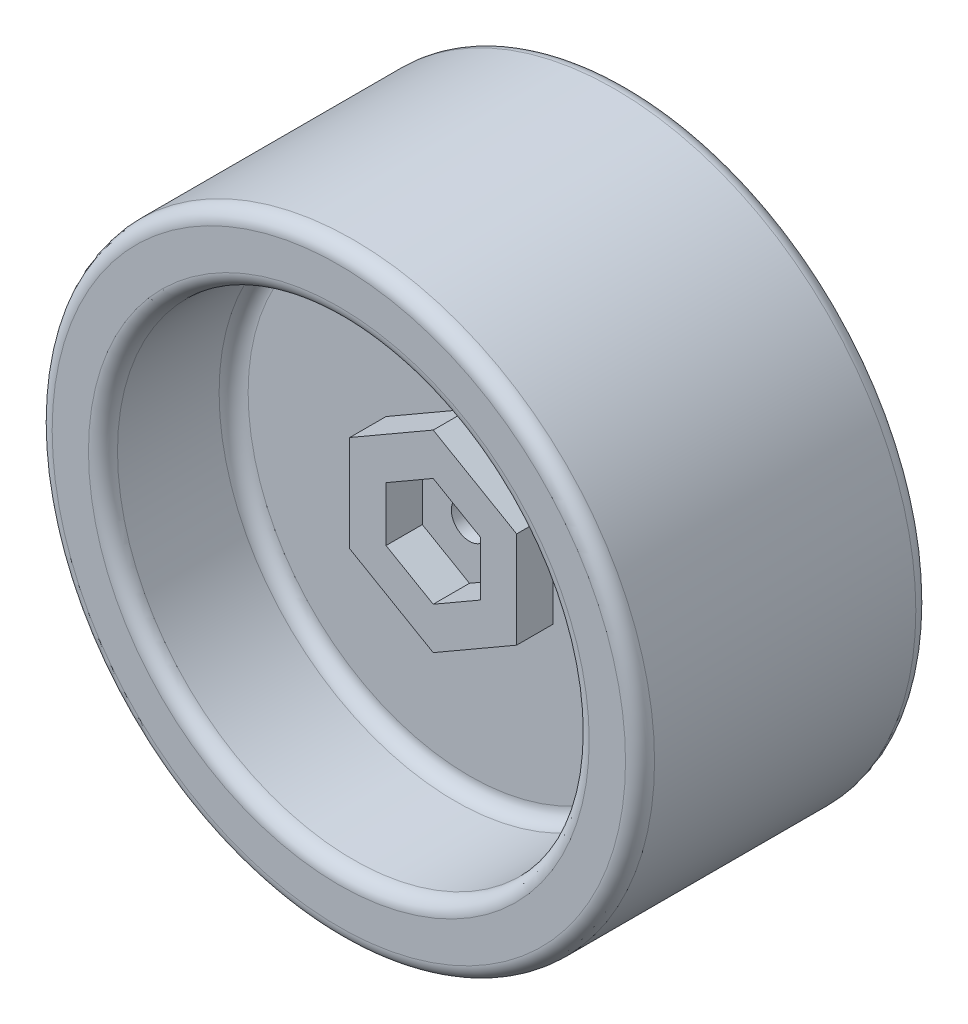
ISO-10303-21;
HEADER;
FILE_DESCRIPTION(('STEP AP214'),'2;1');
FILE_NAME('part.step','',(''),(''),'','','');
FILE_SCHEMA(('AUTOMOTIVE_DESIGN { 1 0 10303 214 1 1 1 1 }'));
ENDSEC;
DATA;
#1=APPLICATION_CONTEXT('core data for automotive mechanical design processes');
#2=APPLICATION_PROTOCOL_DEFINITION('international standard','automotive_design',2000,#1);
#3=PRODUCT_CONTEXT('',#1,'mechanical');
#4=PRODUCT('Part','Part','',(#3));
#5=PRODUCT_RELATED_PRODUCT_CATEGORY('part','',(#4));
#6=PRODUCT_DEFINITION_FORMATION('','',#4);
#7=PRODUCT_DEFINITION_CONTEXT('part definition',#1,'design');
#8=PRODUCT_DEFINITION('design','',#6,#7);
#9=PRODUCT_DEFINITION_SHAPE('','',#8);
#10=(LENGTH_UNIT() NAMED_UNIT(*) SI_UNIT(.MILLI.,.METRE.));
#11=(NAMED_UNIT(*) PLANE_ANGLE_UNIT() SI_UNIT($,.RADIAN.));
#12=(NAMED_UNIT(*) SI_UNIT($,.STERADIAN.) SOLID_ANGLE_UNIT());
#13=UNCERTAINTY_MEASURE_WITH_UNIT(LENGTH_MEASURE(1.E-05),#10,'distance_accuracy_value','');
#14=(GEOMETRIC_REPRESENTATION_CONTEXT(3) GLOBAL_UNCERTAINTY_ASSIGNED_CONTEXT((#13)) GLOBAL_UNIT_ASSIGNED_CONTEXT((#10,
#11,#12)) REPRESENTATION_CONTEXT('',''));
#15=CARTESIAN_POINT('',(0.,0.,0.));
#16=DIRECTION('',(0.,0.,1.));
#17=DIRECTION('',(1.,0.,0.));
#18=AXIS2_PLACEMENT_3D('',#15,#16,#17);
#19=CARTESIAN_POINT('',(0.,0.,0.));
#20=DIRECTION('',(0.,0.,1.));
#21=DIRECTION('',(1.,0.,0.));
#22=AXIS2_PLACEMENT_3D('',#19,#20,#21);
#23=CYLINDRICAL_SURFACE('',#22,2.5);
#24=CARTESIAN_POINT('',(0.,0.,18.));
#25=DIRECTION('',(0.,0.,-1.));
#26=DIRECTION('',(-1.,0.,0.));
#27=AXIS2_PLACEMENT_3D('',#24,#25,#26);
#28=CIRCLE('',#27,2.5);
#29=CARTESIAN_POINT('',(-2.5,0.,18.));
#30=VERTEX_POINT('',#29);
#31=EDGE_CURVE('E265',#30,#30,#28,.F.);
#32=ORIENTED_EDGE('',*,*,#31,.F.);
#33=EDGE_LOOP('',(#32));
#34=FACE_BOUND('',#33,.T.);
#35=CARTESIAN_POINT('',(0.,0.,22.));
#36=DIRECTION('',(0.,0.,1.));
#37=DIRECTION('',(1.,0.,0.));
#38=AXIS2_PLACEMENT_3D('',#35,#36,#37);
#39=CIRCLE('',#38,2.5);
#40=CARTESIAN_POINT('',(2.5,0.,22.));
#41=VERTEX_POINT('',#40);
#42=EDGE_CURVE('E177',#41,#41,#39,.F.);
#43=ORIENTED_EDGE('',*,*,#42,.F.);
#44=EDGE_LOOP('',(#43));
#45=FACE_BOUND('',#44,.T.);
#46=ADVANCED_FACE('F41',(#34,#45),#23,.F.);
#47=CARTESIAN_POINT('',(0.,0.,22.));
#48=DIRECTION('',(0.,0.,1.));
#49=DIRECTION('',(1.,0.,0.));
#50=AXIS2_PLACEMENT_3D('',#47,#48,#49);
#51=PLANE('',#50);
#52=CARTESIAN_POINT('',(0.,0.,22.));
#53=DIRECTION('',(0.,0.,1.));
#54=DIRECTION('',(1.,0.,0.));
#55=AXIS2_PLACEMENT_3D('',#52,#53,#54);
#56=CIRCLE('',#55,30.5);
#57=CARTESIAN_POINT('',(30.5,0.,22.));
#58=VERTEX_POINT('',#57);
#59=EDGE_CURVE('E281',#58,#58,#56,.T.);
#60=ORIENTED_EDGE('',*,*,#59,.T.);
#61=EDGE_LOOP('',(#60));
#62=FACE_BOUND('',#61,.T.);
#63=DIRECTION('',(-0.866025403784439,0.5,0.));
#64=VECTOR('',#63,1.);
#65=CARTESIAN_POINT('',(11.5,6.6395280956807,22.));
#66=LINE('',#65,#64);
#67=CARTESIAN_POINT('',(11.5,6.6395280956807,22.));
#68=VERTEX_POINT('',#67);
#69=CARTESIAN_POINT('',(0.,13.2790561913614,22.));
#70=VERTEX_POINT('',#69);
#71=EDGE_CURVE('E231',#68,#70,#66,.T.);
#72=ORIENTED_EDGE('',*,*,#71,.F.);
#73=DIRECTION('',(0.,1.,0.));
#74=VECTOR('',#73,1.);
#75=CARTESIAN_POINT('',(11.5,-6.6395280956807,22.));
#76=LINE('',#75,#74);
#77=CARTESIAN_POINT('',(11.5,-6.6395280956807,22.));
#78=VERTEX_POINT('',#77);
#79=EDGE_CURVE('E152',#78,#68,#76,.T.);
#80=ORIENTED_EDGE('',*,*,#79,.F.);
#81=DIRECTION('',(0.866025403784439,0.5,0.));
#82=VECTOR('',#81,1.);
#83=CARTESIAN_POINT('',(0.,-13.2790561913614,22.));
#84=LINE('',#83,#82);
#85=CARTESIAN_POINT('',(0.,-13.2790561913614,22.));
#86=VERTEX_POINT('',#85);
#87=EDGE_CURVE('E212',#86,#78,#84,.T.);
#88=ORIENTED_EDGE('',*,*,#87,.F.);
#89=DIRECTION('',(0.866025403784439,-0.5,0.));
#90=VECTOR('',#89,1.);
#91=CARTESIAN_POINT('',(-11.5,-6.6395280956807,22.));
#92=LINE('',#91,#90);
#93=CARTESIAN_POINT('',(-11.5,-6.6395280956807,22.));
#94=VERTEX_POINT('',#93);
#95=EDGE_CURVE('E240',#94,#86,#92,.T.);
#96=ORIENTED_EDGE('',*,*,#95,.F.);
#97=DIRECTION('',(0.,-1.,0.));
#98=VECTOR('',#97,1.);
#99=CARTESIAN_POINT('',(-11.5,6.6395280956807,22.));
#100=LINE('',#99,#98);
#101=CARTESIAN_POINT('',(-11.5,6.6395280956807,22.));
#102=VERTEX_POINT('',#101);
#103=EDGE_CURVE('E237',#102,#94,#100,.T.);
#104=ORIENTED_EDGE('',*,*,#103,.F.);
#105=DIRECTION('',(-0.866025403784439,-0.5,0.));
#106=VECTOR('',#105,1.);
#107=CARTESIAN_POINT('',(0.,13.2790561913614,22.));
#108=LINE('',#107,#106);
#109=EDGE_CURVE('E234',#70,#102,#108,.T.);
#110=ORIENTED_EDGE('',*,*,#109,.F.);
#111=EDGE_LOOP('',(#72,#80,#88,#96,#104,#110));
#112=FACE_BOUND('',#111,.T.);
#113=ADVANCED_FACE('F336',(#62,#112),#51,.T.);
#114=DIRECTION('',(0.,1.,0.));
#115=VECTOR('',#114,1.);
#116=CARTESIAN_POINT('',(6.5,-3.75277674973257,22.));
#117=LINE('',#116,#115);
#118=CARTESIAN_POINT('',(6.5,-3.75277674973257,22.));
#119=VERTEX_POINT('',#118);
#120=CARTESIAN_POINT('',(6.5,3.75277674973257,22.));
#121=VERTEX_POINT('',#120);
#122=EDGE_CURVE('E65',#119,#121,#117,.T.);
#123=ORIENTED_EDGE('',*,*,#122,.T.);
#124=DIRECTION('',(-0.866025403784439,0.5,0.));
#125=VECTOR('',#124,1.);
#126=CARTESIAN_POINT('',(6.5,3.75277674973257,22.));
#127=LINE('',#126,#125);
#128=CARTESIAN_POINT('',(0.,7.50555349946514,22.));
#129=VERTEX_POINT('',#128);
#130=EDGE_CURVE('E150',#121,#129,#127,.T.);
#131=ORIENTED_EDGE('',*,*,#130,.T.);
#132=DIRECTION('',(-0.866025403784439,-0.5,0.));
#133=VECTOR('',#132,1.);
#134=CARTESIAN_POINT('',(0.,7.50555349946514,22.));
#135=LINE('',#134,#133);
#136=CARTESIAN_POINT('',(-6.5,3.75277674973257,22.));
#137=VERTEX_POINT('',#136);
#138=EDGE_CURVE('E180',#129,#137,#135,.T.);
#139=ORIENTED_EDGE('',*,*,#138,.T.);
#140=DIRECTION('',(0.,-1.,0.));
#141=VECTOR('',#140,1.);
#142=CARTESIAN_POINT('',(-6.5,3.75277674973257,22.));
#143=LINE('',#142,#141);
#144=CARTESIAN_POINT('',(-6.5,-3.75277674973257,22.));
#145=VERTEX_POINT('',#144);
#146=EDGE_CURVE('E183',#137,#145,#143,.T.);
#147=ORIENTED_EDGE('',*,*,#146,.T.);
#148=DIRECTION('',(0.866025403784439,-0.5,0.));
#149=VECTOR('',#148,1.);
#150=CARTESIAN_POINT('',(-6.5,-3.75277674973257,22.));
#151=LINE('',#150,#149);
#152=CARTESIAN_POINT('',(0.,-7.50555349946514,22.));
#153=VERTEX_POINT('',#152);
#154=EDGE_CURVE('E186',#145,#153,#151,.T.);
#155=ORIENTED_EDGE('',*,*,#154,.T.);
#156=DIRECTION('',(0.866025403784439,0.5,0.));
#157=VECTOR('',#156,1.);
#158=CARTESIAN_POINT('',(0.,-7.50555349946514,22.));
#159=LINE('',#158,#157);
#160=EDGE_CURVE('E144',#153,#119,#159,.T.);
#161=ORIENTED_EDGE('',*,*,#160,.T.);
#162=EDGE_LOOP('',(#123,#131,#139,#147,#155,#161));
#163=FACE_BOUND('',#162,.T.);
#164=ORIENTED_EDGE('',*,*,#42,.T.);
#165=EDGE_LOOP('',(#164));
#166=FACE_BOUND('',#165,.T.);
#167=ADVANCED_FACE('F331',(#163,#166),#51,.T.);
#168=CARTESIAN_POINT('',(0.,0.,40.));
#169=DIRECTION('',(0.,0.,-1.));
#170=DIRECTION('',(-1.,0.,0.));
#171=AXIS2_PLACEMENT_3D('',#168,#169,#170);
#172=CYLINDRICAL_SURFACE('',#171,41.5);
#173=CARTESIAN_POINT('',(0.,0.,2.));
#174=DIRECTION('',(0.,0.,1.));
#175=DIRECTION('',(1.,0.,0.));
#176=AXIS2_PLACEMENT_3D('',#173,#174,#175);
#177=CIRCLE('',#176,41.5);
#178=CARTESIAN_POINT('',(41.5,0.,2.));
#179=VERTEX_POINT('',#178);
#180=EDGE_CURVE('E11',#179,#179,#177,.T.);
#181=ORIENTED_EDGE('',*,*,#180,.T.);
#182=EDGE_LOOP('',(#181));
#183=FACE_BOUND('',#182,.T.);
#184=CARTESIAN_POINT('',(0.,0.,38.));
#185=DIRECTION('',(0.,0.,1.));
#186=DIRECTION('',(1.,0.,0.));
#187=AXIS2_PLACEMENT_3D('',#184,#185,#186);
#188=CIRCLE('',#187,41.5);
#189=CARTESIAN_POINT('',(41.5,0.,38.));
#190=VERTEX_POINT('',#189);
#191=EDGE_CURVE('E50',#190,#190,#188,.F.);
#192=ORIENTED_EDGE('',*,*,#191,.T.);
#193=EDGE_LOOP('',(#192));
#194=FACE_BOUND('',#193,.T.);
#195=ADVANCED_FACE('F312',(#183,#194),#172,.T.);
#196=CARTESIAN_POINT('',(0.,0.,40.));
#197=DIRECTION('',(0.,0.,1.));
#198=DIRECTION('',(1.,0.,0.));
#199=AXIS2_PLACEMENT_3D('',#196,#197,#198);
#200=PLANE('',#199);
#201=CARTESIAN_POINT('',(0.,0.,40.));
#202=DIRECTION('',(0.,0.,1.));
#203=DIRECTION('',(1.,0.,0.));
#204=AXIS2_PLACEMENT_3D('',#201,#202,#203);
#205=CIRCLE('',#204,34.5);
#206=CARTESIAN_POINT('',(34.5,0.,40.));
#207=VERTEX_POINT('',#206);
#208=EDGE_CURVE('E297',#207,#207,#205,.F.);
#209=ORIENTED_EDGE('',*,*,#208,.T.);
#210=EDGE_LOOP('',(#209));
#211=FACE_BOUND('',#210,.T.);
#212=CARTESIAN_POINT('',(0.,0.,40.));
#213=DIRECTION('',(0.,0.,1.));
#214=DIRECTION('',(1.,0.,0.));
#215=AXIS2_PLACEMENT_3D('',#212,#213,#214);
#216=CIRCLE('',#215,39.5);
#217=CARTESIAN_POINT('',(39.5,0.,40.));
#218=VERTEX_POINT('',#217);
#219=EDGE_CURVE('E293',#218,#218,#216,.T.);
#220=ORIENTED_EDGE('',*,*,#219,.T.);
#221=EDGE_LOOP('',(#220));
#222=FACE_BOUND('',#221,.T.);
#223=ADVANCED_FACE('F319',(#211,#222),#200,.T.);
#224=CARTESIAN_POINT('',(0.,0.,0.));
#225=DIRECTION('',(0.,0.,1.));
#226=DIRECTION('',(1.,0.,0.));
#227=AXIS2_PLACEMENT_3D('',#224,#225,#226);
#228=PLANE('',#227);
#229=CARTESIAN_POINT('',(0.,0.,0.));
#230=DIRECTION('',(0.,0.,1.));
#231=DIRECTION('',(1.,0.,0.));
#232=AXIS2_PLACEMENT_3D('',#229,#230,#231);
#233=CIRCLE('',#232,34.5);
#234=CARTESIAN_POINT('',(34.5,0.,0.));
#235=VERTEX_POINT('',#234);
#236=EDGE_CURVE('E305',#235,#235,#233,.T.);
#237=ORIENTED_EDGE('',*,*,#236,.T.);
#238=EDGE_LOOP('',(#237));
#239=FACE_BOUND('',#238,.T.);
#240=CARTESIAN_POINT('',(0.,0.,0.));
#241=DIRECTION('',(0.,0.,1.));
#242=DIRECTION('',(1.,0.,0.));
#243=AXIS2_PLACEMENT_3D('',#240,#241,#242);
#244=CIRCLE('',#243,39.5);
#245=CARTESIAN_POINT('',(39.5,0.,0.));
#246=VERTEX_POINT('',#245);
#247=EDGE_CURVE('E301',#246,#246,#244,.F.);
#248=ORIENTED_EDGE('',*,*,#247,.T.);
#249=EDGE_LOOP('',(#248));
#250=FACE_BOUND('',#249,.T.);
#251=ADVANCED_FACE('F321',(#239,#250),#228,.F.);
#252=CARTESIAN_POINT('',(0.,0.,18.));
#253=DIRECTION('',(0.,0.,-1.));
#254=DIRECTION('',(-1.,0.,0.));
#255=AXIS2_PLACEMENT_3D('',#252,#253,#254);
#256=PLANE('',#255);
#257=CARTESIAN_POINT('',(0.,0.,18.));
#258=DIRECTION('',(0.,0.,-1.));
#259=DIRECTION('',(-1.,0.,0.));
#260=AXIS2_PLACEMENT_3D('',#257,#258,#259);
#261=CIRCLE('',#260,30.5);
#262=CARTESIAN_POINT('',(-30.5,0.,18.));
#263=VERTEX_POINT('',#262);
#264=EDGE_CURVE('E269',#263,#263,#261,.T.);
#265=ORIENTED_EDGE('',*,*,#264,.T.);
#266=EDGE_LOOP('',(#265));
#267=FACE_BOUND('',#266,.T.);
#268=ORIENTED_EDGE('',*,*,#31,.T.);
#269=EDGE_LOOP('',(#268));
#270=FACE_BOUND('',#269,.T.);
#271=ADVANCED_FACE('F328',(#267,#270),#256,.T.);
#272=CARTESIAN_POINT('',(0.,0.,18.));
#273=DIRECTION('',(0.,0.,-1.));
#274=DIRECTION('',(-1.,0.,0.));
#275=AXIS2_PLACEMENT_3D('',#272,#273,#274);
#276=CYLINDRICAL_SURFACE('',#275,32.5);
#277=CARTESIAN_POINT('',(0.,0.,16.));
#278=DIRECTION('',(0.,0.,-1.));
#279=DIRECTION('',(-1.,0.,0.));
#280=AXIS2_PLACEMENT_3D('',#277,#278,#279);
#281=CIRCLE('',#280,32.5);
#282=CARTESIAN_POINT('',(-32.5,0.,16.));
#283=VERTEX_POINT('',#282);
#284=EDGE_CURVE('E277',#283,#283,#281,.F.);
#285=ORIENTED_EDGE('',*,*,#284,.T.);
#286=EDGE_LOOP('',(#285));
#287=FACE_BOUND('',#286,.T.);
#288=CARTESIAN_POINT('',(0.,0.,2.));
#289=DIRECTION('',(0.,0.,1.));
#290=DIRECTION('',(1.,0.,0.));
#291=AXIS2_PLACEMENT_3D('',#288,#289,#290);
#292=CIRCLE('',#291,32.5);
#293=CARTESIAN_POINT('',(32.5,0.,2.));
#294=VERTEX_POINT('',#293);
#295=EDGE_CURVE('E273',#294,#294,#292,.F.);
#296=ORIENTED_EDGE('',*,*,#295,.T.);
#297=EDGE_LOOP('',(#296));
#298=FACE_BOUND('',#297,.T.);
#299=ADVANCED_FACE('F346',(#287,#298),#276,.F.);
#300=CARTESIAN_POINT('',(0.,0.,22.));
#301=DIRECTION('',(0.,0.,1.));
#302=DIRECTION('',(1.,0.,0.));
#303=AXIS2_PLACEMENT_3D('',#300,#301,#302);
#304=CYLINDRICAL_SURFACE('',#303,32.5);
#305=CARTESIAN_POINT('',(0.,0.,24.));
#306=DIRECTION('',(0.,0.,1.));
#307=DIRECTION('',(1.,0.,0.));
#308=AXIS2_PLACEMENT_3D('',#305,#306,#307);
#309=CIRCLE('',#308,32.5);
#310=CARTESIAN_POINT('',(32.5,0.,24.));
#311=VERTEX_POINT('',#310);
#312=EDGE_CURVE('E289',#311,#311,#309,.F.);
#313=ORIENTED_EDGE('',*,*,#312,.T.);
#314=EDGE_LOOP('',(#313));
#315=FACE_BOUND('',#314,.T.);
#316=CARTESIAN_POINT('',(0.,0.,38.));
#317=DIRECTION('',(0.,0.,1.));
#318=DIRECTION('',(1.,0.,0.));
#319=AXIS2_PLACEMENT_3D('',#316,#317,#318);
#320=CIRCLE('',#319,32.5);
#321=CARTESIAN_POINT('',(32.5,0.,38.));
#322=VERTEX_POINT('',#321);
#323=EDGE_CURVE('E285',#322,#322,#320,.T.);
#324=ORIENTED_EDGE('',*,*,#323,.T.);
#325=EDGE_LOOP('',(#324));
#326=FACE_BOUND('',#325,.T.);
#327=ADVANCED_FACE('F349',(#315,#326),#304,.F.);
#328=CARTESIAN_POINT('',(0.,0.,16.));
#329=DIRECTION('',(0.,0.,-1.));
#330=DIRECTION('',(-1.,0.,0.));
#331=AXIS2_PLACEMENT_3D('',#328,#329,#330);
#332=TOROIDAL_SURFACE('',#331,30.5,2.);
#333=ORIENTED_EDGE('',*,*,#284,.F.);
#334=EDGE_LOOP('',(#333));
#335=FACE_BOUND('',#334,.T.);
#336=ORIENTED_EDGE('',*,*,#264,.F.);
#337=EDGE_LOOP('',(#336));
#338=FACE_BOUND('',#337,.T.);
#339=ADVANCED_FACE('F355',(#335,#338),#332,.F.);
#340=CARTESIAN_POINT('',(0.,0.,24.));
#341=DIRECTION('',(0.,0.,1.));
#342=DIRECTION('',(1.,0.,0.));
#343=AXIS2_PLACEMENT_3D('',#340,#341,#342);
#344=TOROIDAL_SURFACE('',#343,30.5,2.);
#345=ORIENTED_EDGE('',*,*,#312,.F.);
#346=EDGE_LOOP('',(#345));
#347=FACE_BOUND('',#346,.T.);
#348=ORIENTED_EDGE('',*,*,#59,.F.);
#349=EDGE_LOOP('',(#348));
#350=FACE_BOUND('',#349,.T.);
#351=ADVANCED_FACE('F491',(#347,#350),#344,.F.);
#352=CARTESIAN_POINT('',(0.,0.,38.));
#353=DIRECTION('',(0.,0.,1.));
#354=DIRECTION('',(1.,0.,0.));
#355=AXIS2_PLACEMENT_3D('',#352,#353,#354);
#356=TOROIDAL_SURFACE('',#355,34.5,2.);
#357=ORIENTED_EDGE('',*,*,#208,.F.);
#358=EDGE_LOOP('',(#357));
#359=FACE_BOUND('',#358,.T.);
#360=ORIENTED_EDGE('',*,*,#323,.F.);
#361=EDGE_LOOP('',(#360));
#362=FACE_BOUND('',#361,.T.);
#363=ADVANCED_FACE('F483',(#359,#362),#356,.T.);
#364=CARTESIAN_POINT('',(0.,0.,2.));
#365=DIRECTION('',(0.,0.,1.));
#366=DIRECTION('',(1.,0.,0.));
#367=AXIS2_PLACEMENT_3D('',#364,#365,#366);
#368=TOROIDAL_SURFACE('',#367,34.5,2.);
#369=ORIENTED_EDGE('',*,*,#236,.F.);
#370=EDGE_LOOP('',(#369));
#371=FACE_BOUND('',#370,.T.);
#372=ORIENTED_EDGE('',*,*,#295,.F.);
#373=EDGE_LOOP('',(#372));
#374=FACE_BOUND('',#373,.T.);
#375=ADVANCED_FACE('F476',(#371,#374),#368,.T.);
#376=CARTESIAN_POINT('',(0.,0.,2.));
#377=DIRECTION('',(0.,0.,1.));
#378=DIRECTION('',(1.,0.,0.));
#379=AXIS2_PLACEMENT_3D('',#376,#377,#378);
#380=TOROIDAL_SURFACE('',#379,39.5,2.);
#381=ORIENTED_EDGE('',*,*,#247,.F.);
#382=EDGE_LOOP('',(#381));
#383=FACE_BOUND('',#382,.T.);
#384=ORIENTED_EDGE('',*,*,#180,.F.);
#385=EDGE_LOOP('',(#384));
#386=FACE_BOUND('',#385,.T.);
#387=ADVANCED_FACE('F316',(#383,#386),#380,.T.);
#388=CARTESIAN_POINT('',(0.,0.,38.));
#389=DIRECTION('',(0.,0.,1.));
#390=DIRECTION('',(1.,0.,0.));
#391=AXIS2_PLACEMENT_3D('',#388,#389,#390);
#392=TOROIDAL_SURFACE('',#391,39.5,2.);
#393=ORIENTED_EDGE('',*,*,#191,.F.);
#394=EDGE_LOOP('',(#393));
#395=FACE_BOUND('',#394,.T.);
#396=ORIENTED_EDGE('',*,*,#219,.F.);
#397=EDGE_LOOP('',(#396));
#398=FACE_BOUND('',#397,.T.);
#399=ADVANCED_FACE('F43',(#395,#398),#392,.T.);
#400=CARTESIAN_POINT('',(0.,0.,27.));
#401=DIRECTION('',(0.,0.,1.));
#402=DIRECTION('',(1.,0.,0.));
#403=AXIS2_PLACEMENT_3D('',#400,#401,#402);
#404=PLANE('',#403);
#405=DIRECTION('',(0.,1.,0.));
#406=VECTOR('',#405,1.);
#407=CARTESIAN_POINT('',(11.5,-6.6395280956807,27.));
#408=LINE('',#407,#406);
#409=CARTESIAN_POINT('',(11.5,-6.6395280956807,27.));
#410=VERTEX_POINT('',#409);
#411=CARTESIAN_POINT('',(11.5,6.6395280956807,27.));
#412=VERTEX_POINT('',#411);
#413=EDGE_CURVE('E207',#410,#412,#408,.T.);
#414=ORIENTED_EDGE('',*,*,#413,.T.);
#415=DIRECTION('',(-0.866025403784439,0.5,0.));
#416=VECTOR('',#415,1.);
#417=CARTESIAN_POINT('',(11.5,6.6395280956807,27.));
#418=LINE('',#417,#416);
#419=CARTESIAN_POINT('',(0.,13.2790561913614,27.));
#420=VERTEX_POINT('',#419);
#421=EDGE_CURVE('E211',#412,#420,#418,.T.);
#422=ORIENTED_EDGE('',*,*,#421,.T.);
#423=DIRECTION('',(-0.866025403784439,-0.5,0.));
#424=VECTOR('',#423,1.);
#425=CARTESIAN_POINT('',(0.,13.2790561913614,27.));
#426=LINE('',#425,#424);
#427=CARTESIAN_POINT('',(-11.5,6.6395280956807,27.));
#428=VERTEX_POINT('',#427);
#429=EDGE_CURVE('E215',#420,#428,#426,.T.);
#430=ORIENTED_EDGE('',*,*,#429,.T.);
#431=DIRECTION('',(0.,-1.,0.));
#432=VECTOR('',#431,1.);
#433=CARTESIAN_POINT('',(-11.5,6.6395280956807,27.));
#434=LINE('',#433,#432);
#435=CARTESIAN_POINT('',(-11.5,-6.6395280956807,27.));
#436=VERTEX_POINT('',#435);
#437=EDGE_CURVE('E218',#428,#436,#434,.T.);
#438=ORIENTED_EDGE('',*,*,#437,.T.);
#439=DIRECTION('',(0.866025403784439,-0.5,0.));
#440=VECTOR('',#439,1.);
#441=CARTESIAN_POINT('',(-11.5,-6.6395280956807,27.));
#442=LINE('',#441,#440);
#443=CARTESIAN_POINT('',(0.,-13.2790561913614,27.));
#444=VERTEX_POINT('',#443);
#445=EDGE_CURVE('E221',#436,#444,#442,.T.);
#446=ORIENTED_EDGE('',*,*,#445,.T.);
#447=DIRECTION('',(0.866025403784439,0.5,0.));
#448=VECTOR('',#447,1.);
#449=CARTESIAN_POINT('',(0.,-13.2790561913614,27.));
#450=LINE('',#449,#448);
#451=EDGE_CURVE('E224',#444,#410,#450,.T.);
#452=ORIENTED_EDGE('',*,*,#451,.T.);
#453=EDGE_LOOP('',(#414,#422,#430,#438,#446,#452));
#454=FACE_BOUND('',#453,.T.);
#455=DIRECTION('',(-0.866025403784439,0.5,0.));
#456=VECTOR('',#455,1.);
#457=CARTESIAN_POINT('',(6.5,3.75277674973257,27.));
#458=LINE('',#457,#456);
#459=CARTESIAN_POINT('',(6.5,3.75277674973257,27.));
#460=VERTEX_POINT('',#459);
#461=CARTESIAN_POINT('',(0.,7.50555349946514,27.));
#462=VERTEX_POINT('',#461);
#463=EDGE_CURVE('E143',#460,#462,#458,.T.);
#464=ORIENTED_EDGE('',*,*,#463,.F.);
#465=DIRECTION('',(0.,1.,0.));
#466=VECTOR('',#465,1.);
#467=CARTESIAN_POINT('',(6.5,-3.75277674973257,27.));
#468=LINE('',#467,#466);
#469=CARTESIAN_POINT('',(6.5,-3.75277674973257,27.));
#470=VERTEX_POINT('',#469);
#471=EDGE_CURVE('E133',#470,#460,#468,.T.);
#472=ORIENTED_EDGE('',*,*,#471,.F.);
#473=DIRECTION('',(0.866025403784439,0.5,0.));
#474=VECTOR('',#473,1.);
#475=CARTESIAN_POINT('',(0.,-7.50555349946514,27.));
#476=LINE('',#475,#474);
#477=CARTESIAN_POINT('',(0.,-7.50555349946514,27.));
#478=VERTEX_POINT('',#477);
#479=EDGE_CURVE('E172',#478,#470,#476,.T.);
#480=ORIENTED_EDGE('',*,*,#479,.F.);
#481=DIRECTION('',(0.866025403784439,-0.5,0.));
#482=VECTOR('',#481,1.);
#483=CARTESIAN_POINT('',(-6.5,-3.75277674973257,27.));
#484=LINE('',#483,#482);
#485=CARTESIAN_POINT('',(-6.5,-3.75277674973257,27.));
#486=VERTEX_POINT('',#485);
#487=EDGE_CURVE('E168',#486,#478,#484,.T.);
#488=ORIENTED_EDGE('',*,*,#487,.F.);
#489=DIRECTION('',(0.,-1.,0.));
#490=VECTOR('',#489,1.);
#491=CARTESIAN_POINT('',(-6.5,3.75277674973257,27.));
#492=LINE('',#491,#490);
#493=CARTESIAN_POINT('',(-6.5,3.75277674973257,27.));
#494=VERTEX_POINT('',#493);
#495=EDGE_CURVE('E162',#494,#486,#492,.T.);
#496=ORIENTED_EDGE('',*,*,#495,.F.);
#497=DIRECTION('',(-0.866025403784439,-0.5,0.));
#498=VECTOR('',#497,1.);
#499=CARTESIAN_POINT('',(0.,7.50555349946514,27.));
#500=LINE('',#499,#498);
#501=EDGE_CURVE('E158',#462,#494,#500,.T.);
#502=ORIENTED_EDGE('',*,*,#501,.F.);
#503=EDGE_LOOP('',(#464,#472,#480,#488,#496,#502));
#504=FACE_BOUND('',#503,.T.);
#505=ADVANCED_FACE('F156',(#454,#504),#404,.T.);
#506=CARTESIAN_POINT('',(11.5,-6.6395280956807,27.));
#507=DIRECTION('',(-1.,0.,0.));
#508=DIRECTION('',(0.,0.,1.));
#509=AXIS2_PLACEMENT_3D('',#506,#507,#508);
#510=PLANE('',#509);
#511=ORIENTED_EDGE('',*,*,#79,.T.);
#512=DIRECTION('',(0.,0.,-1.));
#513=VECTOR('',#512,1.);
#514=CARTESIAN_POINT('',(11.5,6.6395280956807,27.));
#515=LINE('',#514,#513);
#516=EDGE_CURVE('E262',#412,#68,#515,.T.);
#517=ORIENTED_EDGE('',*,*,#516,.F.);
#518=ORIENTED_EDGE('',*,*,#413,.F.);
#519=DIRECTION('',(0.,0.,-1.));
#520=VECTOR('',#519,1.);
#521=CARTESIAN_POINT('',(11.5,-6.6395280956807,27.));
#522=LINE('',#521,#520);
#523=EDGE_CURVE('E227',#410,#78,#522,.T.);
#524=ORIENTED_EDGE('',*,*,#523,.T.);
#525=EDGE_LOOP('',(#511,#517,#518,#524));
#526=FACE_BOUND('',#525,.T.);
#527=ADVANCED_FACE('F359',(#526),#510,.F.);
#528=CARTESIAN_POINT('',(11.5,6.6395280956807,27.));
#529=DIRECTION('',(-0.5,-0.866025403784439,0.));
#530=DIRECTION('',(0.866025403784439,-0.5,0.));
#531=AXIS2_PLACEMENT_3D('',#528,#529,#530);
#532=PLANE('',#531);
#533=ORIENTED_EDGE('',*,*,#71,.T.);
#534=DIRECTION('',(0.,0.,-1.));
#535=VECTOR('',#534,1.);
#536=CARTESIAN_POINT('',(0.,13.2790561913614,27.));
#537=LINE('',#536,#535);
#538=EDGE_CURVE('E258',#420,#70,#537,.T.);
#539=ORIENTED_EDGE('',*,*,#538,.F.);
#540=ORIENTED_EDGE('',*,*,#421,.F.);
#541=ORIENTED_EDGE('',*,*,#516,.T.);
#542=EDGE_LOOP('',(#533,#539,#540,#541));
#543=FACE_BOUND('',#542,.T.);
#544=ADVANCED_FACE('F362',(#543),#532,.F.);
#545=CARTESIAN_POINT('',(0.,13.2790561913614,27.));
#546=DIRECTION('',(0.5,-0.866025403784439,0.));
#547=DIRECTION('',(0.866025403784439,0.5,0.));
#548=AXIS2_PLACEMENT_3D('',#545,#546,#547);
#549=PLANE('',#548);
#550=ORIENTED_EDGE('',*,*,#109,.T.);
#551=DIRECTION('',(0.,0.,-1.));
#552=VECTOR('',#551,1.);
#553=CARTESIAN_POINT('',(-11.5,6.6395280956807,27.));
#554=LINE('',#553,#552);
#555=EDGE_CURVE('E254',#428,#102,#554,.T.);
#556=ORIENTED_EDGE('',*,*,#555,.F.);
#557=ORIENTED_EDGE('',*,*,#429,.F.);
#558=ORIENTED_EDGE('',*,*,#538,.T.);
#559=EDGE_LOOP('',(#550,#556,#557,#558));
#560=FACE_BOUND('',#559,.T.);
#561=ADVANCED_FACE('F366',(#560),#549,.F.);
#562=CARTESIAN_POINT('',(-11.5,6.6395280956807,27.));
#563=DIRECTION('',(1.,0.,0.));
#564=DIRECTION('',(0.,0.,-1.));
#565=AXIS2_PLACEMENT_3D('',#562,#563,#564);
#566=PLANE('',#565);
#567=ORIENTED_EDGE('',*,*,#103,.T.);
#568=DIRECTION('',(0.,0.,-1.));
#569=VECTOR('',#568,1.);
#570=CARTESIAN_POINT('',(-11.5,-6.6395280956807,27.));
#571=LINE('',#570,#569);
#572=EDGE_CURVE('E250',#436,#94,#571,.T.);
#573=ORIENTED_EDGE('',*,*,#572,.F.);
#574=ORIENTED_EDGE('',*,*,#437,.F.);
#575=ORIENTED_EDGE('',*,*,#555,.T.);
#576=EDGE_LOOP('',(#567,#573,#574,#575));
#577=FACE_BOUND('',#576,.T.);
#578=ADVANCED_FACE('F370',(#577),#566,.F.);
#579=CARTESIAN_POINT('',(-11.5,-6.6395280956807,27.));
#580=DIRECTION('',(0.5,0.866025403784439,0.));
#581=DIRECTION('',(-0.866025403784439,0.5,0.));
#582=AXIS2_PLACEMENT_3D('',#579,#580,#581);
#583=PLANE('',#582);
#584=ORIENTED_EDGE('',*,*,#95,.T.);
#585=DIRECTION('',(0.,0.,-1.));
#586=VECTOR('',#585,1.);
#587=CARTESIAN_POINT('',(0.,-13.2790561913614,27.));
#588=LINE('',#587,#586);
#589=EDGE_CURVE('E57',#444,#86,#588,.T.);
#590=ORIENTED_EDGE('',*,*,#589,.F.);
#591=ORIENTED_EDGE('',*,*,#445,.F.);
#592=ORIENTED_EDGE('',*,*,#572,.T.);
#593=EDGE_LOOP('',(#584,#590,#591,#592));
#594=FACE_BOUND('',#593,.T.);
#595=ADVANCED_FACE('F374',(#594),#583,.F.);
#596=CARTESIAN_POINT('',(0.,-13.2790561913614,27.));
#597=DIRECTION('',(-0.5,0.866025403784439,0.));
#598=DIRECTION('',(-0.866025403784439,-0.5,0.));
#599=AXIS2_PLACEMENT_3D('',#596,#597,#598);
#600=PLANE('',#599);
#601=ORIENTED_EDGE('',*,*,#87,.T.);
#602=ORIENTED_EDGE('',*,*,#523,.F.);
#603=ORIENTED_EDGE('',*,*,#451,.F.);
#604=ORIENTED_EDGE('',*,*,#589,.T.);
#605=EDGE_LOOP('',(#601,#602,#603,#604));
#606=FACE_BOUND('',#605,.T.);
#607=ADVANCED_FACE('F378',(#606),#600,.F.);
#608=CARTESIAN_POINT('',(6.5,-3.75277674973257,27.));
#609=DIRECTION('',(-1.,0.,0.));
#610=DIRECTION('',(0.,0.,1.));
#611=AXIS2_PLACEMENT_3D('',#608,#609,#610);
#612=PLANE('',#611);
#613=ORIENTED_EDGE('',*,*,#122,.F.);
#614=DIRECTION('',(0.,0.,-1.));
#615=VECTOR('',#614,1.);
#616=CARTESIAN_POINT('',(6.5,-3.75277674973257,27.));
#617=LINE('',#616,#615);
#618=EDGE_CURVE('E138',#470,#119,#617,.T.);
#619=ORIENTED_EDGE('',*,*,#618,.F.);
#620=ORIENTED_EDGE('',*,*,#471,.T.);
#621=DIRECTION('',(0.,0.,-1.));
#622=VECTOR('',#621,1.);
#623=CARTESIAN_POINT('',(6.5,3.75277674973257,27.));
#624=LINE('',#623,#622);
#625=EDGE_CURVE('E136',#460,#121,#624,.T.);
#626=ORIENTED_EDGE('',*,*,#625,.T.);
#627=EDGE_LOOP('',(#613,#619,#620,#626));
#628=FACE_BOUND('',#627,.T.);
#629=ADVANCED_FACE('F135',(#628),#612,.T.);
#630=CARTESIAN_POINT('',(6.5,3.75277674973257,27.));
#631=DIRECTION('',(-0.5,-0.866025403784439,0.));
#632=DIRECTION('',(0.866025403784439,-0.5,0.));
#633=AXIS2_PLACEMENT_3D('',#630,#631,#632);
#634=PLANE('',#633);
#635=ORIENTED_EDGE('',*,*,#130,.F.);
#636=ORIENTED_EDGE('',*,*,#625,.F.);
#637=ORIENTED_EDGE('',*,*,#463,.T.);
#638=DIRECTION('',(0.,0.,-1.));
#639=VECTOR('',#638,1.);
#640=CARTESIAN_POINT('',(0.,7.50555349946514,27.));
#641=LINE('',#640,#639);
#642=EDGE_CURVE('E153',#462,#129,#641,.T.);
#643=ORIENTED_EDGE('',*,*,#642,.T.);
#644=EDGE_LOOP('',(#635,#636,#637,#643));
#645=FACE_BOUND('',#644,.T.);
#646=ADVANCED_FACE('F147',(#645),#634,.T.);
#647=CARTESIAN_POINT('',(0.,7.50555349946514,27.));
#648=DIRECTION('',(0.5,-0.866025403784439,0.));
#649=DIRECTION('',(0.866025403784439,0.5,0.));
#650=AXIS2_PLACEMENT_3D('',#647,#648,#649);
#651=PLANE('',#650);
#652=ORIENTED_EDGE('',*,*,#138,.F.);
#653=ORIENTED_EDGE('',*,*,#642,.F.);
#654=ORIENTED_EDGE('',*,*,#501,.T.);
#655=DIRECTION('',(0.,0.,-1.));
#656=VECTOR('',#655,1.);
#657=CARTESIAN_POINT('',(-6.5,3.75277674973257,27.));
#658=LINE('',#657,#656);
#659=EDGE_CURVE('E201',#494,#137,#658,.T.);
#660=ORIENTED_EDGE('',*,*,#659,.T.);
#661=EDGE_LOOP('',(#652,#653,#654,#660));
#662=FACE_BOUND('',#661,.T.);
#663=ADVANCED_FACE('F389',(#662),#651,.T.);
#664=CARTESIAN_POINT('',(-6.5,3.75277674973257,27.));
#665=DIRECTION('',(1.,0.,0.));
#666=DIRECTION('',(0.,0.,-1.));
#667=AXIS2_PLACEMENT_3D('',#664,#665,#666);
#668=PLANE('',#667);
#669=ORIENTED_EDGE('',*,*,#146,.F.);
#670=ORIENTED_EDGE('',*,*,#659,.F.);
#671=ORIENTED_EDGE('',*,*,#495,.T.);
#672=DIRECTION('',(0.,0.,-1.));
#673=VECTOR('',#672,1.);
#674=CARTESIAN_POINT('',(-6.5,-3.75277674973257,27.));
#675=LINE('',#674,#673);
#676=EDGE_CURVE('E197',#486,#145,#675,.T.);
#677=ORIENTED_EDGE('',*,*,#676,.T.);
#678=EDGE_LOOP('',(#669,#670,#671,#677));
#679=FACE_BOUND('',#678,.T.);
#680=ADVANCED_FACE('F392',(#679),#668,.T.);
#681=CARTESIAN_POINT('',(-6.5,-3.75277674973257,27.));
#682=DIRECTION('',(0.5,0.866025403784439,0.));
#683=DIRECTION('',(-0.866025403784439,0.5,0.));
#684=AXIS2_PLACEMENT_3D('',#681,#682,#683);
#685=PLANE('',#684);
#686=ORIENTED_EDGE('',*,*,#154,.F.);
#687=ORIENTED_EDGE('',*,*,#676,.F.);
#688=ORIENTED_EDGE('',*,*,#487,.T.);
#689=DIRECTION('',(0.,0.,-1.));
#690=VECTOR('',#689,1.);
#691=CARTESIAN_POINT('',(0.,-7.50555349946514,27.));
#692=LINE('',#691,#690);
#693=EDGE_CURVE('E193',#478,#153,#692,.T.);
#694=ORIENTED_EDGE('',*,*,#693,.T.);
#695=EDGE_LOOP('',(#686,#687,#688,#694));
#696=FACE_BOUND('',#695,.T.);
#697=ADVANCED_FACE('F396',(#696),#685,.T.);
#698=CARTESIAN_POINT('',(0.,-7.50555349946514,27.));
#699=DIRECTION('',(-0.5,0.866025403784439,0.));
#700=DIRECTION('',(-0.866025403784439,-0.5,0.));
#701=AXIS2_PLACEMENT_3D('',#698,#699,#700);
#702=PLANE('',#701);
#703=ORIENTED_EDGE('',*,*,#160,.F.);
#704=ORIENTED_EDGE('',*,*,#693,.F.);
#705=ORIENTED_EDGE('',*,*,#479,.T.);
#706=ORIENTED_EDGE('',*,*,#618,.T.);
#707=EDGE_LOOP('',(#703,#704,#705,#706));
#708=FACE_BOUND('',#707,.T.);
#709=ADVANCED_FACE('F400',(#708),#702,.T.);
#710=CLOSED_SHELL('',(#46,#113,#167,#195,#223,#251,#271,#299,#327,#339,#351,#363,#375,#387,#399,
#505,#527,#544,#561,#578,#595,#607,#629,#646,#663,#680,#697,#709));
#711=MANIFOLD_SOLID_BREP('B2',#710);
#712=ADVANCED_BREP_SHAPE_REPRESENTATION('',(#18,#711),#14);
#713=SHAPE_DEFINITION_REPRESENTATION(#9,#712);
ENDSEC;
END-ISO-10303-21;
